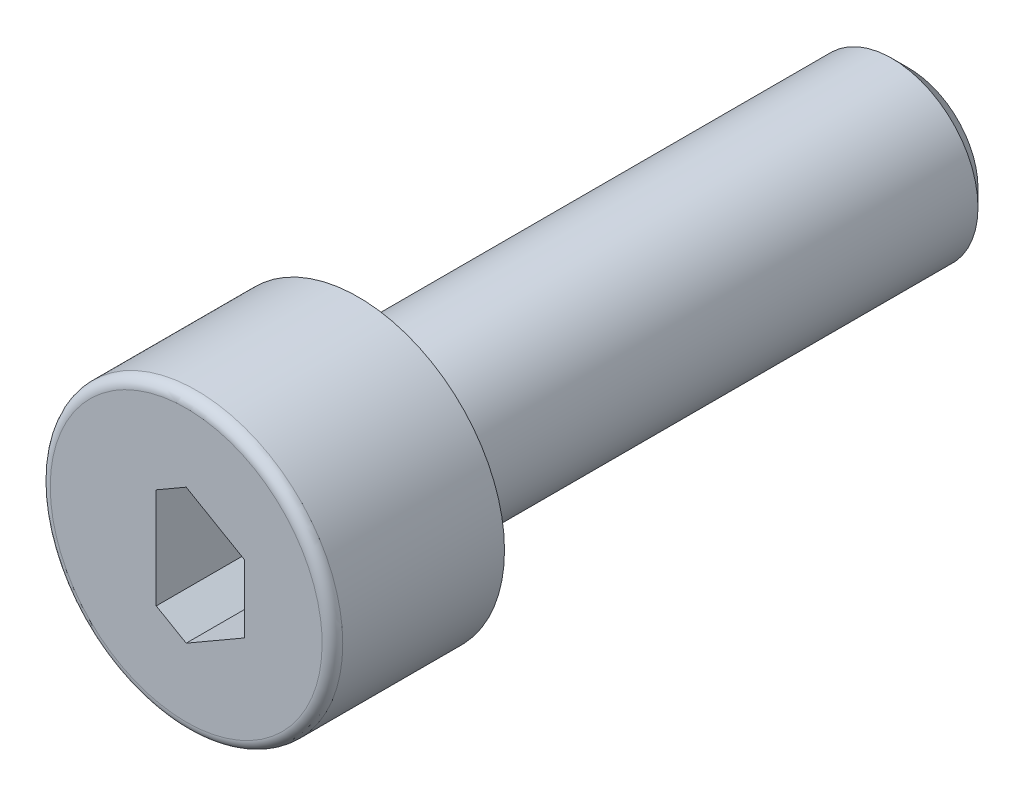
ISO-10303-21;
HEADER;
FILE_DESCRIPTION(('STEP AP214'),'2;1');
FILE_NAME('part.step','',(''),(''),'','','');
FILE_SCHEMA(('AUTOMOTIVE_DESIGN { 1 0 10303 214 1 1 1 1 }'));
ENDSEC;
DATA;
#1=APPLICATION_CONTEXT('core data for automotive mechanical design processes');
#2=APPLICATION_PROTOCOL_DEFINITION('international standard','automotive_design',2000,#1);
#3=PRODUCT_CONTEXT('',#1,'mechanical');
#4=PRODUCT('Part','Part','',(#3));
#5=PRODUCT_RELATED_PRODUCT_CATEGORY('part','',(#4));
#6=PRODUCT_DEFINITION_FORMATION('','',#4);
#7=PRODUCT_DEFINITION_CONTEXT('part definition',#1,'design');
#8=PRODUCT_DEFINITION('design','',#6,#7);
#9=PRODUCT_DEFINITION_SHAPE('','',#8);
#10=(LENGTH_UNIT() NAMED_UNIT(*) SI_UNIT(.MILLI.,.METRE.));
#11=(NAMED_UNIT(*) PLANE_ANGLE_UNIT() SI_UNIT($,.RADIAN.));
#12=(NAMED_UNIT(*) SI_UNIT($,.STERADIAN.) SOLID_ANGLE_UNIT());
#13=UNCERTAINTY_MEASURE_WITH_UNIT(LENGTH_MEASURE(1.E-05),#10,'distance_accuracy_value','');
#14=(GEOMETRIC_REPRESENTATION_CONTEXT(3) GLOBAL_UNCERTAINTY_ASSIGNED_CONTEXT((#13)) GLOBAL_UNIT_ASSIGNED_CONTEXT((#10,
#11,#12)) REPRESENTATION_CONTEXT('',''));
#15=CARTESIAN_POINT('',(0.,0.,0.));
#16=DIRECTION('',(0.,0.,1.));
#17=DIRECTION('',(1.,0.,0.));
#18=AXIS2_PLACEMENT_3D('',#15,#16,#17);
#19=CARTESIAN_POINT('',(-324.3,996.037009084755,-4.));
#20=DIRECTION('',(0.,0.,1.));
#21=DIRECTION('',(1.,0.,0.));
#22=AXIS2_PLACEMENT_3D('',#19,#20,#21);
#23=PLANE('',#22);
#24=DIRECTION('',(0.866025403784444,0.499999999999991,0.));
#25=VECTOR('',#24,1.);
#26=CARTESIAN_POINT('',(-325.999999999999,999.962990915245,-4.));
#27=LINE('',#26,#25);
#28=CARTESIAN_POINT('',(-326.869999999999,999.46069618105,-4.));
#29=VERTEX_POINT('',#28);
#30=CARTESIAN_POINT('',(-325.999999999999,999.962990915245,-4.));
#31=VERTEX_POINT('',#30);
#32=EDGE_CURVE('E71',#29,#31,#27,.T.);
#33=ORIENTED_EDGE('',*,*,#32,.F.);
#34=DIRECTION('',(0.,1.,0.));
#35=VECTOR('',#34,1.);
#36=CARTESIAN_POINT('',(-326.869999999999,997.018504542378,-4.));
#37=LINE('',#36,#35);
#38=CARTESIAN_POINT('',(-326.869999999999,996.53930381895,-4.));
#39=VERTEX_POINT('',#38);
#40=EDGE_CURVE('E73',#39,#29,#37,.T.);
#41=ORIENTED_EDGE('',*,*,#40,.F.);
#42=DIRECTION('',(-0.866025403784444,0.499999999999991,0.));
#43=VECTOR('',#42,1.);
#44=CARTESIAN_POINT('',(-327.699999999999,997.018504542378,-4.));
#45=LINE('',#44,#43);
#46=CARTESIAN_POINT('',(-325.999999999999,996.037009084755,-4.));
#47=VERTEX_POINT('',#46);
#48=EDGE_CURVE('E194',#47,#39,#45,.T.);
#49=ORIENTED_EDGE('',*,*,#48,.F.);
#50=DIRECTION('',(-0.866025403784444,-0.499999999999991,0.));
#51=VECTOR('',#50,1.);
#52=CARTESIAN_POINT('',(-325.999999999999,996.037009084755,-4.));
#53=LINE('',#52,#51);
#54=CARTESIAN_POINT('',(-324.3,997.018504542378,-4.));
#55=VERTEX_POINT('',#54);
#56=EDGE_CURVE('E199',#55,#47,#53,.T.);
#57=ORIENTED_EDGE('',*,*,#56,.F.);
#58=DIRECTION('',(0.,1.,0.));
#59=VECTOR('',#58,1.);
#60=CARTESIAN_POINT('',(-324.3,997.018504542378,-4.));
#61=LINE('',#60,#59);
#62=CARTESIAN_POINT('',(-324.3,998.981495457622,-4.));
#63=VERTEX_POINT('',#62);
#64=EDGE_CURVE('E204',#63,#55,#61,.F.);
#65=ORIENTED_EDGE('',*,*,#64,.F.);
#66=DIRECTION('',(0.866025403784444,-0.499999999999991,0.));
#67=VECTOR('',#66,1.);
#68=CARTESIAN_POINT('',(-324.3,998.981495457622,-4.));
#69=LINE('',#68,#67);
#70=EDGE_CURVE('E76',#31,#63,#69,.T.);
#71=ORIENTED_EDGE('',*,*,#70,.F.);
#72=EDGE_LOOP('',(#33,#41,#49,#57,#65,#71));
#73=FACE_BOUND('',#72,.T.);
#74=ADVANCED_FACE('F16',(#73),#23,.T.);
#75=CARTESIAN_POINT('',(-324.3,998.981495457622,-1.5));
#76=DIRECTION('',(-0.499999999999991,-0.866025403784444,0.));
#77=DIRECTION('',(0.866025403784444,-0.499999999999991,0.));
#78=AXIS2_PLACEMENT_3D('',#75,#76,#77);
#79=PLANE('',#78);
#80=DIRECTION('',(0.866025403784393,-0.500000000000079,0.));
#81=VECTOR('',#80,1.);
#82=CARTESIAN_POINT('',(-325.999999999999,999.962990915245,-1.5));
#83=LINE('',#82,#81);
#84=CARTESIAN_POINT('',(-326.,999.962990915245,-1.5));
#85=VERTEX_POINT('',#84);
#86=CARTESIAN_POINT('',(-324.3,998.981495457622,-1.5));
#87=VERTEX_POINT('',#86);
#88=EDGE_CURVE('E96',#85,#87,#83,.T.);
#89=ORIENTED_EDGE('',*,*,#88,.F.);
#90=DIRECTION('',(0.,0.,1.));
#91=VECTOR('',#90,1.);
#92=CARTESIAN_POINT('',(-325.999999999999,999.962990915245,-1.5));
#93=LINE('',#92,#91);
#94=EDGE_CURVE('E81',#31,#85,#93,.T.);
#95=ORIENTED_EDGE('',*,*,#94,.F.);
#96=ORIENTED_EDGE('',*,*,#70,.T.);
#97=DIRECTION('',(0.,0.,1.));
#98=VECTOR('',#97,1.);
#99=CARTESIAN_POINT('',(-324.3,998.981495457622,-4.));
#100=LINE('',#99,#98);
#101=EDGE_CURVE('E202',#87,#63,#100,.F.);
#102=ORIENTED_EDGE('',*,*,#101,.F.);
#103=EDGE_LOOP('',(#89,#95,#96,#102));
#104=FACE_BOUND('',#103,.T.);
#105=ADVANCED_FACE('F129',(#104),#79,.T.);
#106=CARTESIAN_POINT('',(-324.3,997.018504542378,-4.));
#107=DIRECTION('',(-1.,0.,0.));
#108=DIRECTION('',(0.,0.,1.));
#109=AXIS2_PLACEMENT_3D('',#106,#107,#108);
#110=PLANE('',#109);
#111=DIRECTION('',(0.,1.,0.));
#112=VECTOR('',#111,1.);
#113=CARTESIAN_POINT('',(-324.3,994.05,-1.5));
#114=LINE('',#113,#112);
#115=CARTESIAN_POINT('',(-324.3,997.018504542378,-1.5));
#116=VERTEX_POINT('',#115);
#117=EDGE_CURVE('E99',#87,#116,#114,.F.);
#118=ORIENTED_EDGE('',*,*,#117,.F.);
#119=ORIENTED_EDGE('',*,*,#101,.T.);
#120=ORIENTED_EDGE('',*,*,#64,.T.);
#121=DIRECTION('',(0.,0.,1.));
#122=VECTOR('',#121,1.);
#123=CARTESIAN_POINT('',(-324.3,997.018504542378,-1.5));
#124=LINE('',#123,#122);
#125=EDGE_CURVE('E196',#116,#55,#124,.F.);
#126=ORIENTED_EDGE('',*,*,#125,.F.);
#127=EDGE_LOOP('',(#118,#119,#120,#126));
#128=FACE_BOUND('',#127,.T.);
#129=ADVANCED_FACE('F132',(#128),#110,.T.);
#130=CARTESIAN_POINT('',(-325.999999999999,996.037009084755,-1.5));
#131=DIRECTION('',(-0.499999999999991,0.866025403784444,0.));
#132=DIRECTION('',(-0.866025403784444,-0.499999999999991,0.));
#133=AXIS2_PLACEMENT_3D('',#130,#131,#132);
#134=PLANE('',#133);
#135=DIRECTION('',(-0.866025403784442,-0.499999999999994,0.));
#136=VECTOR('',#135,1.);
#137=CARTESIAN_POINT('',(-324.3,997.018504542378,-1.5));
#138=LINE('',#137,#136);
#139=CARTESIAN_POINT('',(-325.999999999999,996.037009084755,-1.5));
#140=VERTEX_POINT('',#139);
#141=EDGE_CURVE('E189',#116,#140,#138,.T.);
#142=ORIENTED_EDGE('',*,*,#141,.F.);
#143=ORIENTED_EDGE('',*,*,#125,.T.);
#144=ORIENTED_EDGE('',*,*,#56,.T.);
#145=DIRECTION('',(0.,0.,1.));
#146=VECTOR('',#145,1.);
#147=CARTESIAN_POINT('',(-325.999999999999,996.037009084755,-1.5));
#148=LINE('',#147,#146);
#149=EDGE_CURVE('E90',#140,#47,#148,.F.);
#150=ORIENTED_EDGE('',*,*,#149,.F.);
#151=EDGE_LOOP('',(#142,#143,#144,#150));
#152=FACE_BOUND('',#151,.T.);
#153=ADVANCED_FACE('F136',(#152),#134,.T.);
#154=CARTESIAN_POINT('',(-327.699999999999,997.018504542378,-1.5));
#155=DIRECTION('',(0.499999999999991,0.866025403784444,0.));
#156=DIRECTION('',(-0.866025403784444,0.499999999999991,0.));
#157=AXIS2_PLACEMENT_3D('',#154,#155,#156);
#158=PLANE('',#157);
#159=DIRECTION('',(-0.866025403784432,0.500000000000012,0.));
#160=VECTOR('',#159,1.);
#161=CARTESIAN_POINT('',(-325.999999999999,996.037009084755,-1.5));
#162=LINE('',#161,#160);
#163=CARTESIAN_POINT('',(-326.869999999999,996.53930381895,-1.5));
#164=VERTEX_POINT('',#163);
#165=EDGE_CURVE('E188',#140,#164,#162,.T.);
#166=ORIENTED_EDGE('',*,*,#165,.F.);
#167=ORIENTED_EDGE('',*,*,#149,.T.);
#168=ORIENTED_EDGE('',*,*,#48,.T.);
#169=DIRECTION('',(0.,0.,-1.));
#170=VECTOR('',#169,1.);
#171=CARTESIAN_POINT('',(-326.869999999999,996.53930381895,-1.5));
#172=LINE('',#171,#170);
#173=EDGE_CURVE('E82',#164,#39,#172,.T.);
#174=ORIENTED_EDGE('',*,*,#173,.F.);
#175=EDGE_LOOP('',(#166,#167,#168,#174));
#176=FACE_BOUND('',#175,.T.);
#177=ADVANCED_FACE('F140',(#176),#158,.T.);
#178=CARTESIAN_POINT('',(-326.869999999999,997.018504542378,-1.5));
#179=DIRECTION('',(1.,0.,0.));
#180=DIRECTION('',(0.,0.,-1.));
#181=AXIS2_PLACEMENT_3D('',#178,#179,#180);
#182=PLANE('',#181);
#183=DIRECTION('',(0.,1.,0.));
#184=VECTOR('',#183,1.);
#185=CARTESIAN_POINT('',(-326.869999999999,994.05,-1.5));
#186=LINE('',#185,#184);
#187=CARTESIAN_POINT('',(-326.869999999999,999.46069618105,-1.5));
#188=VERTEX_POINT('',#187);
#189=EDGE_CURVE('E104',#164,#188,#186,.T.);
#190=ORIENTED_EDGE('',*,*,#189,.F.);
#191=ORIENTED_EDGE('',*,*,#173,.T.);
#192=ORIENTED_EDGE('',*,*,#40,.T.);
#193=DIRECTION('',(0.,0.,-1.));
#194=VECTOR('',#193,1.);
#195=CARTESIAN_POINT('',(-326.869999999999,999.46069618105,-1.5));
#196=LINE('',#195,#194);
#197=EDGE_CURVE('E88',#188,#29,#196,.T.);
#198=ORIENTED_EDGE('',*,*,#197,.F.);
#199=EDGE_LOOP('',(#190,#191,#192,#198));
#200=FACE_BOUND('',#199,.T.);
#201=ADVANCED_FACE('F87',(#200),#182,.T.);
#202=CARTESIAN_POINT('',(-325.999999999999,999.962990915245,-1.5));
#203=DIRECTION('',(0.499999999999991,-0.866025403784444,0.));
#204=DIRECTION('',(0.866025403784444,0.499999999999991,0.));
#205=AXIS2_PLACEMENT_3D('',#202,#203,#204);
#206=PLANE('',#205);
#207=DIRECTION('',(0.866025403784439,0.5,0.));
#208=VECTOR('',#207,1.);
#209=CARTESIAN_POINT('',(-327.7,998.981495457622,-1.5));
#210=LINE('',#209,#208);
#211=EDGE_CURVE('E94',#188,#85,#210,.T.);
#212=ORIENTED_EDGE('',*,*,#211,.F.);
#213=ORIENTED_EDGE('',*,*,#197,.T.);
#214=ORIENTED_EDGE('',*,*,#32,.T.);
#215=ORIENTED_EDGE('',*,*,#94,.T.);
#216=EDGE_LOOP('',(#212,#213,#214,#215));
#217=FACE_BOUND('',#216,.T.);
#218=ADVANCED_FACE('F92',(#217),#206,.T.);
#219=CARTESIAN_POINT('',(-322.049999999999,994.05,-1.5));
#220=DIRECTION('',(0.,0.,1.));
#221=DIRECTION('',(1.,0.,0.));
#222=AXIS2_PLACEMENT_3D('',#219,#220,#221);
#223=PLANE('',#222);
#224=CARTESIAN_POINT('',(-325.999999999999,998.,-1.50000000000003));
#225=DIRECTION('',(0.,0.,1.));
#226=DIRECTION('',(0.,-1.,0.));
#227=AXIS2_PLACEMENT_3D('',#224,#225,#226);
#228=CIRCLE('',#227,3.94999999999958);
#229=CARTESIAN_POINT('',(-322.05,997.99999970947,-1.50000000000003));
#230=VERTEX_POINT('',#229);
#231=CARTESIAN_POINT('',(-329.949999999999,998.000000559802,-1.50000000000003));
#232=VERTEX_POINT('',#231);
#233=EDGE_CURVE('E20',#230,#232,#228,.F.);
#234=ORIENTED_EDGE('',*,*,#233,.F.);
#235=CARTESIAN_POINT('',(-329.949999999999,998.000000559802,-1.50000000000003));
#236=CARTESIAN_POINT('',(-329.950000201211,998.041520300938,-1.50000000000003));
#237=CARTESIAN_POINT('',(-329.949345348693,998.083039822195,-1.50000000000003));
#238=CARTESIAN_POINT('',(-329.946746883813,998.165411616338,-1.50000000000003));
#239=CARTESIAN_POINT('',(-329.944822858638,998.206264507837,-1.50000000000004));
#240=CARTESIAN_POINT('',(-329.939746180695,998.287266126637,-1.50000000000004));
#241=CARTESIAN_POINT('',(-329.936612794236,998.327416056794,-1.50000000000004));
#242=CARTESIAN_POINT('',(-329.92917835615,998.406976402403,-1.50000000000005));
#243=CARTESIAN_POINT('',(-329.92489622207,998.446388607871,-1.50000000000005));
#244=CARTESIAN_POINT('',(-329.910503710292,998.562539695931,-1.50000000000008));
#245=CARTESIAN_POINT('',(-329.898726680059,998.639079214281,-1.50000000000011));
#246=CARTESIAN_POINT('',(-329.871150474946,998.7888649247,-1.50000000000024));
#247=CARTESIAN_POINT('',(-329.855493770986,998.862137545276,-1.50000000000034));
#248=CARTESIAN_POINT('',(-329.820632729762,999.00524156466,-1.50000000000064));
#249=CARTESIAN_POINT('',(-329.80156452867,999.075106103458,-1.50000000000085));
#250=CARTESIAN_POINT('',(-329.760343546415,999.21128369495,-1.50000000000144));
#251=CARTESIAN_POINT('',(-329.73832030513,999.277635994192,-1.50000000000182));
#252=CARTESIAN_POINT('',(-329.691636635685,999.406723012603,-1.50000000000285));
#253=CARTESIAN_POINT('',(-329.667099002665,999.469502158809,-1.50000000000349));
#254=CARTESIAN_POINT('',(-329.615815913377,999.591413907714,-1.50000000000512));
#255=CARTESIAN_POINT('',(-329.589186425091,999.650595315758,-1.5000000000061));
#256=CARTESIAN_POINT('',(-329.534128862298,999.765316224483,-1.50000000000854));
#257=CARTESIAN_POINT('',(-329.505809914452,999.820908118998,-1.50000000000997));
#258=CARTESIAN_POINT('',(-329.447761051236,999.92848392741,-1.50000000001344));
#259=CARTESIAN_POINT('',(-329.418133464703,999.980523079904,-1.50000000001545));
#260=CARTESIAN_POINT('',(-329.357832286438,1000.08105268043,-1.5000000000202));
#261=CARTESIAN_POINT('',(-329.327254319956,1000.12960050847,-1.50000000002292));
#262=CARTESIAN_POINT('',(-329.265394077482,1000.22322826329,-1.50000000002925));
#263=CARTESIAN_POINT('',(-329.234200860539,1000.26836705211,-1.50000000003283));
#264=CARTESIAN_POINT('',(-329.171428297444,1000.35527545742,-1.50000000004105));
#265=CARTESIAN_POINT('',(-329.139931618013,1000.3971048026,-1.50000000004564));
#266=CARTESIAN_POINT('',(-329.076846886734,1000.47750757276,-1.50000000005609));
#267=CARTESIAN_POINT('',(-329.045335312077,1000.51614102265,-1.50000000006188));
#268=CARTESIAN_POINT('',(-328.982492410992,1000.59027666666,-1.50000000007494));
#269=CARTESIAN_POINT('',(-328.951231601381,1000.62583865309,-1.50000000008212));
#270=CARTESIAN_POINT('',(-328.889139488024,1000.69396436586,-1.50000000009817));
#271=CARTESIAN_POINT('',(-328.858372977514,1000.72658717422,-1.50000000010694));
#272=CARTESIAN_POINT('',(-328.797496415016,1000.7889737285,-1.50000000012643));
#273=CARTESIAN_POINT('',(-328.767445719189,1000.81879538064,-1.50000000013702));
#274=CARTESIAN_POINT('',(-328.708208722116,1000.87572067657,-1.50000000016039));
#275=CARTESIAN_POINT('',(-328.679076499729,1000.90288073217,-1.50000000017301));
#276=CARTESIAN_POINT('',(-328.596040958612,1000.97797961694,-1.50000000021329));
#277=CARTESIAN_POINT('',(-328.541212169472,1001.0249031719,-1.50000000024485));
#278=CARTESIAN_POINT('',(-328.436860662363,1001.10936960294,-1.50000000032054));
#279=CARTESIAN_POINT('',(-328.387658604604,1001.14731020448,-1.50000000036231));
#280=CARTESIAN_POINT('',(-328.295597052191,1001.2148996821,-1.50000000046472));
#281=CARTESIAN_POINT('',(-328.252994622025,1001.24489888833,-1.50000000052122));
#282=CARTESIAN_POINT('',(-328.174942663191,1001.29758258538,-1.50000000064918));
#283=CARTESIAN_POINT('',(-328.139693367367,1001.32056419649,-1.50000000071567));
#284=CARTESIAN_POINT('',(-328.0769595213,1001.36005199479,-1.50000000089137));
#285=CARTESIAN_POINT('',(-328.0496250007,1001.37679687997,-1.50000000098664));
#286=CARTESIAN_POINT('',(-328.003164365647,1001.40448640261,-1.50000000117243));
#287=CARTESIAN_POINT('',(-327.984143524184,1001.41560784222,-1.50000000125512));
#288=CARTESIAN_POINT('',(-327.954612086012,1001.43254672642,-1.50000000154896));
#289=CARTESIAN_POINT('',(-327.944165377987,1001.43847602498,-1.50000000168458));
#290=CARTESIAN_POINT('',(-327.879288447023,1001.4749098052,-1.50000000283912));
#291=CARTESIAN_POINT('',(-327.824156993508,1001.50418157614,-1.50000000517701));
#292=CARTESIAN_POINT('',(-327.709970304559,1001.56137585183,-1.50000001023269));
#293=CARTESIAN_POINT('',(-327.650851932599,1001.58917194741,-1.5000000129631));
#294=CARTESIAN_POINT('',(-327.528647243855,1001.64297029384,-1.50000001887059));
#295=CARTESIAN_POINT('',(-327.465501443755,1001.6688376059,-1.50000002206214));
#296=CARTESIAN_POINT('',(-327.335235820325,1001.71829764506,-1.50000002839604));
#297=CARTESIAN_POINT('',(-327.268061322337,1001.74174645467,-1.50000003153048));
#298=CARTESIAN_POINT('',(-327.129774837884,1001.78586522178,-1.50000003749404));
#299=CARTESIAN_POINT('',(-327.058614136891,1001.80638242388,-1.50000004030544));
#300=CARTESIAN_POINT('',(-326.912431425595,1001.84411129798,-1.5000000453769));
#301=CARTESIAN_POINT('',(-326.837367514539,1001.86116153976,-1.50000004761098));
#302=CARTESIAN_POINT('',(-326.723060882825,1001.88363523797,-1.50000005039729));
#303=CARTESIAN_POINT('',(-326.684130472807,1001.89068322963,-1.50000005123933));
#304=CARTESIAN_POINT('',(-326.605357000374,1001.90372524151,-1.50000005272512));
#305=CARTESIAN_POINT('',(-326.565510311683,1001.9096975173,-1.50000005336495));
#306=CARTESIAN_POINT('',(-326.484932763569,1001.92051657385,-1.50000005443419));
#307=CARTESIAN_POINT('',(-326.444198922404,1001.9253411048,-1.5000000548596));
#308=CARTESIAN_POINT('',(-326.361877530669,1001.93379313558,-1.50000005549227));
#309=CARTESIAN_POINT('',(-326.320287643676,1001.93739790692,-1.50000005569554));
#310=CARTESIAN_POINT('',(-326.236289454195,1001.94333835224,-1.50000005588011));
#311=CARTESIAN_POINT('',(-326.193879511006,1001.94565083486,-1.50000005585749));
#312=CARTESIAN_POINT('',(-326.108280765557,1001.94893451922,-1.50000005559058));
#313=CARTESIAN_POINT('',(-326.065091055509,1001.94988208854,-1.5000000553425));
#314=CARTESIAN_POINT('',(-325.977976959328,1001.95036382441,-1.50000005462898));
#315=CARTESIAN_POINT('',(-325.934052439131,1001.94987394084,-1.50000005415996));
#316=CARTESIAN_POINT('',(-325.845517629247,1001.94740897653,-1.50000005301292));
#317=CARTESIAN_POINT('',(-325.800908018927,1001.94540945416,-1.50000005233157));
#318=CARTESIAN_POINT('',(-325.711056817735,1001.93985401025,-1.50000005077233));
#319=CARTESIAN_POINT('',(-325.665816759362,1001.93627328434,-1.50000004989141));
#320=CARTESIAN_POINT('',(-325.57476346148,1001.92748511188,-1.5000000479495));
#321=CARTESIAN_POINT('',(-325.528952646807,1001.92225252981,-1.50000004688586));
#322=CARTESIAN_POINT('',(-325.436821767173,1001.91009150904,-1.50000004459907));
#323=CARTESIAN_POINT('',(-325.390505058017,1001.90313763804,-1.50000004337366));
#324=CARTESIAN_POINT('',(-325.297431556873,1001.88746641227,-1.50000004078797));
#325=CARTESIAN_POINT('',(-325.25067908952,1001.8787233657,-1.50000003942589));
#326=CARTESIAN_POINT('',(-325.156808563041,1001.8594080113,-1.50000003659553));
#327=CARTESIAN_POINT('',(-325.109695834317,1001.84880979228,-1.50000003512595));
#328=CARTESIAN_POINT('',(-325.015184679606,1001.82572052467,-1.50000003211335));
#329=CARTESIAN_POINT('',(-324.9677926255,1001.81320338887,-1.50000003056954));
#330=CARTESIAN_POINT('',(-324.872808165162,1001.78621530705,-1.50000002744547));
#331=CARTESIAN_POINT('',(-324.825223206767,1001.77171814393,-1.50000002586501));
#332=CARTESIAN_POINT('',(-324.729943754066,1001.74071199279,-1.50000002270796));
#333=CARTESIAN_POINT('',(-324.682257816248,1001.72417670682,-1.50000002113178));
#334=CARTESIAN_POINT('',(-324.586872751343,1001.68903972606,-1.50000001803046));
#335=CARTESIAN_POINT('',(-324.539183321054,1001.67041170541,-1.50000001650637));
#336=CARTESIAN_POINT('',(-324.443892934178,1001.63103831076,-1.50000001355015));
#337=CARTESIAN_POINT('',(-324.396302841513,1001.61026663586,-1.50000001211963));
#338=CARTESIAN_POINT('',(-324.30131881429,1001.56655988412,-1.50000000943484));
#339=CARTESIAN_POINT('',(-324.253936945951,1001.54359859883,-1.50000000818331));
#340=CARTESIAN_POINT('',(-324.159480142113,1001.49546880184,-1.50000000579509));
#341=CARTESIAN_POINT('',(-324.112418467903,1001.470274201,-1.50000000466022));
#342=CARTESIAN_POINT('',(-324.045949186027,1001.43293911058,-1.50000000349569));
#343=CARTESIAN_POINT('',(-324.026106882145,1001.42156626872,-1.50000000320506));
#344=CARTESIAN_POINT('',(-323.979222811755,1001.39415138772,-1.50000000265165));
#345=CARTESIAN_POINT('',(-323.952269908476,1001.37795687025,-1.50000000244014));
#346=CARTESIAN_POINT('',(-323.891464400805,1001.34042726082,-1.5000000020236));
#347=CARTESIAN_POINT('',(-323.857733840257,1001.31889428065,-1.50000000183605));
#348=CARTESIAN_POINT('',(-323.783788472817,1001.27009226777,-1.50000000148887));
#349=CARTESIAN_POINT('',(-323.743732329964,1001.24258253063,-1.5000000013438));
#350=CARTESIAN_POINT('',(-323.657687080641,1001.18112210198,-1.50000000107508));
#351=CARTESIAN_POINT('',(-323.611897821366,1001.14689124416,-1.5000000009597));
#352=CARTESIAN_POINT('',(-323.515096406656,1001.07119560857,-1.50000000075094));
#353=CARTESIAN_POINT('',(-323.464330545912,1001.0294157485,-1.50000000066344));
#354=CARTESIAN_POINT('',(-323.358463573771,1000.93776151918,-1.5000000005069));
#355=CARTESIAN_POINT('',(-323.303660171754,1000.88754199295,-1.50000000044176));
#356=CARTESIAN_POINT('',(-323.221343189538,1000.80772370337,-1.50000000035835));
#357=CARTESIAN_POINT('',(-323.19279667412,1000.77918165132,-1.50000000033227));
#358=CARTESIAN_POINT('',(-323.135098922394,1000.71969694802,-1.50000000028404));
#359=CARTESIAN_POINT('',(-323.105996027689,1000.68870729259,-1.50000000026217));
#360=CARTESIAN_POINT('',(-323.047364406161,1000.62421950742,-1.50000000022194));
#361=CARTESIAN_POINT('',(-323.017888163101,1000.5906736741,-1.5000000002038));
#362=CARTESIAN_POINT('',(-322.958702918614,1000.52096837822,-1.50000000017062));
#363=CARTESIAN_POINT('',(-322.929050627316,1000.48476074389,-1.50000000015576));
#364=CARTESIAN_POINT('',(-322.869723226535,1000.40963306847,-1.50000000012876));
#365=CARTESIAN_POINT('',(-322.840109245098,1000.37066474374,-1.50000000011676));
#366=CARTESIAN_POINT('',(-322.781085038777,1000.2899247169,-1.50000000009511));
#367=CARTESIAN_POINT('',(-322.751740507681,1000.24810497578,-1.50000000008558));
#368=CARTESIAN_POINT('',(-322.693498849237,1000.16158121777,-1.50000000006853));
#369=CARTESIAN_POINT('',(-322.664672122793,1000.1168297982,-1.50000000006111));
#370=CARTESIAN_POINT('',(-322.607726832721,1000.02437406982,-1.50000000004795));
#371=CARTESIAN_POINT('',(-322.579683497288,999.976623412352,-1.5000000000423));
#372=CARTESIAN_POINT('',(-322.524582773501,999.878115288461,-1.5000000000324));
#373=CARTESIAN_POINT('',(-322.497605538829,999.82731297362,-1.50000000002821));
#374=CARTESIAN_POINT('',(-322.44493149817,999.722664831366,-1.50000000002097));
#375=CARTESIAN_POINT('',(-322.41931984268,999.668776129439,-1.50000000001797));
#376=CARTESIAN_POINT('',(-322.369687565555,999.557938369076,-1.50000000001287));
#377=CARTESIAN_POINT('',(-322.345757131688,999.500948910561,-1.50000000001081));
#378=CARTESIAN_POINT('',(-322.299813167207,999.383915394347,-1.50000000000738));
#379=CARTESIAN_POINT('',(-322.277894866661,999.323833937146,-1.50000000000604));
#380=CARTESIAN_POINT('',(-322.236315136858,999.200647601006,-1.50000000000387));
#381=CARTESIAN_POINT('',(-322.216753945253,999.137508873179,-1.50000000000306));
#382=CARTESIAN_POINT('',(-322.180240965147,999.008267463941,-1.5000000000018));
#383=CARTESIAN_POINT('',(-322.163394341891,998.942135055991,-1.50000000000136));
#384=CARTESIAN_POINT('',(-322.132673785488,998.806996928091,-1.5000000000007));
#385=CARTESIAN_POINT('',(-322.118909818432,998.73796619435,-1.5000000000005));
#386=CARTESIAN_POINT('',(-322.094726016496,998.597156115717,-1.50000000000021));
#387=CARTESIAN_POINT('',(-322.084420758069,998.525357076088,-1.50000000000014));
#388=CARTESIAN_POINT('',(-322.067532466823,998.379171877386,-1.50000000000006));
#389=CARTESIAN_POINT('',(-322.061068408416,998.304771957941,-1.50000000000004));
#390=CARTESIAN_POINT('',(-322.052239361909,998.153586251964,-1.50000000000003));
#391=CARTESIAN_POINT('',(-322.049997331444,998.076793269274,-1.50000000000004));
#392=CARTESIAN_POINT('',(-322.05,997.99999970947,-1.50000000000003));
#393=B_SPLINE_CURVE_WITH_KNOTS('',3,(#235,#236,#237,#238,#239,#240,#241,#242,#243,#244,#245,
#246,#247,#248,#249,#250,#251,#252,#253,#254,#255,#256,#257,#258,#259,#260,#261,#262,#263,#264,
#265,#266,#267,#268,#269,#270,#271,#272,#273,#274,#275,#276,#277,#278,#279,#280,#281,#282,#283,
#284,#285,#286,#287,#288,#289,#290,#291,#292,#293,#294,#295,#296,#297,#298,#299,#300,#301,#302,
#303,#304,#305,#306,#307,#308,#309,#310,#311,#312,#313,#314,#315,#316,#317,#318,#319,#320,#321,
#322,#323,#324,#325,#326,#327,#328,#329,#330,#331,#332,#333,#334,#335,#336,#337,#338,#339,#340,
#341,#342,#343,#344,#345,#346,#347,#348,#349,#350,#351,#352,#353,#354,#355,#356,#357,#358,#359,
#360,#361,#362,#363,#364,#365,#366,#367,#368,#369,#370,#371,#372,#373,#374,#375,#376,#377,#378,
#379,#380,#381,#382,#383,#384,#385,#386,#387,#388,#389,#390,#391,#392),.UNSPECIFIED.,.F.,.F.,(4,
2,2,2,2,2,2,2,2,2,2,2,2,2,2,2,2,2,2,2,2,2,2,2,2,2,2,2,2,2,2,2,2,2,2,2,2,2,2,2,2,2,2,2,2,2,2,2,2,
2,2,2,2,2,2,2,2,2,2,2,2,2,2,2,2,2,2,2,2,2,2,2,2,2,2,2,2,2,4),(0.,0.124553602267692,
0.247228577186569,0.368024918302497,0.486942619244315,0.719117001172008,0.943779104725157,
1.16092872943295,1.37056568125002,1.57268977255654,1.76730082215872,1.95439865528862,
2.13398310360433,2.30605400519017,2.47061120455672,2.62765455264151,2.77718390680829,
2.91919913084737,3.05370009497665,3.18068667584009,3.30015875650944,3.51653871054522,
3.70286675600257,3.85914016535095,3.9853566437355,4.08151431677314,4.14761174469716,
4.18364791709308,4.3708295716187,4.56673241918978,4.77135613233414,4.98470034350057,
5.20676465210211,5.43754860394722,5.55622368965017,5.67707925175056,5.80011525063355,
5.92533164467811,6.05272839025713,6.18230544173751,6.31406275148017,6.4480002698401,
6.58411794516648,6.72241572380255,6.86289355008579,7.00555136634807,7.15038912198924,
7.29740674652705,7.44660417627612,7.59798134554564,7.75153818663946,7.90727462985558,
8.06519060348669,8.22528603381995,8.29389499013039,8.38821745131919,8.50825235628736,
8.65399837878377,8.82545393889215,9.02261717186804,9.24548595614751,9.36657337753104,
9.49408865671137,9.62803170722532,9.7684024388094,9.91520075739962,10.0684265651313,
10.22807976034,10.3941602375601,10.5666678875264,10.7456025971732,10.9309642496345,
11.1227527242446,11.3209678965377,11.525609638248,11.7366778173096,11.9541722978572,
12.1780929402257,12.4084396009502),.UNSPECIFIED.);
#394=EDGE_CURVE('E107',#232,#230,#393,.T.);
#395=ORIENTED_EDGE('',*,*,#394,.F.);
#396=EDGE_LOOP('',(#234,#395));
#397=FACE_BOUND('',#396,.T.);
#398=ORIENTED_EDGE('',*,*,#189,.T.);
#399=ORIENTED_EDGE('',*,*,#211,.T.);
#400=ORIENTED_EDGE('',*,*,#88,.T.);
#401=ORIENTED_EDGE('',*,*,#117,.T.);
#402=ORIENTED_EDGE('',*,*,#141,.T.);
#403=ORIENTED_EDGE('',*,*,#165,.T.);
#404=EDGE_LOOP('',(#398,#399,#400,#401,#402,#403));
#405=FACE_BOUND('',#404,.T.);
#406=ADVANCED_FACE('F123',(#397,#405),#223,.T.);
#407=CARTESIAN_POINT('',(-325.999999999999,998.,-1.80000000000001));
#408=DIRECTION('',(0.,0.,1.));
#409=DIRECTION('',(0.,-1.,0.));
#410=AXIS2_PLACEMENT_3D('',#407,#408,#409);
#411=TOROIDAL_SURFACE('',#410,3.94999999999961,0.299999999999974);
#412=CARTESIAN_POINT('',(-325.999999999999,998.,-1.79999999999997));
#413=DIRECTION('',(0.,0.,1.));
#414=DIRECTION('',(1.,0.,0.));
#415=AXIS2_PLACEMENT_3D('',#412,#413,#414);
#416=CIRCLE('',#415,4.24999999999998);
#417=CARTESIAN_POINT('',(-321.75,998.,-1.79999999999997));
#418=VERTEX_POINT('',#417);
#419=EDGE_CURVE('E111',#418,#418,#416,.F.);
#420=ORIENTED_EDGE('',*,*,#419,.F.);
#421=EDGE_LOOP('',(#420));
#422=FACE_BOUND('',#421,.T.);
#423=ORIENTED_EDGE('',*,*,#394,.T.);
#424=ORIENTED_EDGE('',*,*,#233,.T.);
#425=EDGE_LOOP('',(#423,#424));
#426=FACE_BOUND('',#425,.T.);
#427=ADVANCED_FACE('F113',(#422,#426),#411,.T.);
#428=CARTESIAN_POINT('',(-328.009499999999,995.9905,-22.5));
#429=DIRECTION('',(0.,0.,-1.));
#430=DIRECTION('',(-1.,0.,0.));
#431=AXIS2_PLACEMENT_3D('',#428,#429,#430);
#432=PLANE('',#431);
#433=CARTESIAN_POINT('',(-325.999999999999,998.,-22.5000000000364));
#434=DIRECTION('',(0.,0.,1.));
#435=DIRECTION('',(1.,0.,0.));
#436=AXIS2_PLACEMENT_3D('',#433,#434,#435);
#437=CIRCLE('',#436,2.00950000004374);
#438=CARTESIAN_POINT('',(-323.990499999956,998.,-22.5000000000364));
#439=VERTEX_POINT('',#438);
#440=EDGE_CURVE('E176',#439,#439,#437,.T.);
#441=ORIENTED_EDGE('',*,*,#440,.F.);
#442=EDGE_LOOP('',(#441));
#443=FACE_BOUND('',#442,.T.);
#444=ADVANCED_FACE('F122',(#443),#432,.T.);
#445=CARTESIAN_POINT('',(-325.999999999999,998.,-1.5));
#446=DIRECTION('',(0.,0.,1.));
#447=DIRECTION('',(1.,0.,0.));
#448=AXIS2_PLACEMENT_3D('',#445,#446,#447);
#449=CYLINDRICAL_SURFACE('',#448,4.24999999999998);
#450=ORIENTED_EDGE('',*,*,#419,.T.);
#451=EDGE_LOOP('',(#450));
#452=FACE_BOUND('',#451,.T.);
#453=CARTESIAN_POINT('',(-325.999999999999,998.,-6.50000000000001));
#454=DIRECTION('',(0.,0.,1.));
#455=DIRECTION('',(1.,0.,0.));
#456=AXIS2_PLACEMENT_3D('',#453,#454,#455);
#457=CIRCLE('',#456,4.24999999999998);
#458=CARTESIAN_POINT('',(-321.75,998.,-6.50000000000001));
#459=VERTEX_POINT('',#458);
#460=EDGE_CURVE('E170',#459,#459,#457,.F.);
#461=ORIENTED_EDGE('',*,*,#460,.F.);
#462=EDGE_LOOP('',(#461));
#463=FACE_BOUND('',#462,.T.);
#464=ADVANCED_FACE('F151',(#452,#463),#449,.T.);
#465=CARTESIAN_POINT('',(-325.999999999999,998.,-22.0095000000811));
#466=DIRECTION('',(0.,0.,1.));
#467=DIRECTION('',(1.,0.,0.));
#468=AXIS2_PLACEMENT_3D('',#465,#466,#467);
#469=CONICAL_SURFACE('',#468,2.49999999999906,0.785398163397448);
#470=CARTESIAN_POINT('',(-325.999999999999,998.,-22.0095));
#471=DIRECTION('',(0.,0.,1.));
#472=DIRECTION('',(1.,0.,0.));
#473=AXIS2_PLACEMENT_3D('',#470,#471,#472);
#474=CIRCLE('',#473,2.5);
#475=CARTESIAN_POINT('',(-323.499999999999,998.,-22.0095));
#476=VERTEX_POINT('',#475);
#477=EDGE_CURVE('E26',#476,#476,#474,.T.);
#478=ORIENTED_EDGE('',*,*,#477,.F.);
#479=EDGE_LOOP('',(#478));
#480=FACE_BOUND('',#479,.T.);
#481=ORIENTED_EDGE('',*,*,#440,.T.);
#482=EDGE_LOOP('',(#481));
#483=FACE_BOUND('',#482,.T.);
#484=ADVANCED_FACE('F155',(#480,#483),#469,.T.);
#485=CARTESIAN_POINT('',(-330.249999999999,993.75,-6.50000000000001));
#486=DIRECTION('',(0.,0.,-1.));
#487=DIRECTION('',(-1.,0.,0.));
#488=AXIS2_PLACEMENT_3D('',#485,#486,#487);
#489=PLANE('',#488);
#490=ORIENTED_EDGE('',*,*,#460,.T.);
#491=EDGE_LOOP('',(#490));
#492=FACE_BOUND('',#491,.T.);
#493=CARTESIAN_POINT('',(-325.999999999999,998.,-6.50000000000001));
#494=DIRECTION('',(0.,0.,1.));
#495=DIRECTION('',(1.,0.,0.));
#496=AXIS2_PLACEMENT_3D('',#493,#494,#495);
#497=CIRCLE('',#496,2.5);
#498=CARTESIAN_POINT('',(-323.499999999999,998.,-6.50000000000001));
#499=VERTEX_POINT('',#498);
#500=EDGE_CURVE('E11',#499,#499,#497,.F.);
#501=ORIENTED_EDGE('',*,*,#500,.F.);
#502=EDGE_LOOP('',(#501));
#503=FACE_BOUND('',#502,.T.);
#504=ADVANCED_FACE('F158',(#492,#503),#489,.T.);
#505=CARTESIAN_POINT('',(-325.999999999999,998.,-1.5));
#506=DIRECTION('',(0.,0.,1.));
#507=DIRECTION('',(1.,0.,0.));
#508=AXIS2_PLACEMENT_3D('',#505,#506,#507);
#509=CYLINDRICAL_SURFACE('',#508,2.5);
#510=ORIENTED_EDGE('',*,*,#500,.T.);
#511=EDGE_LOOP('',(#510));
#512=FACE_BOUND('',#511,.T.);
#513=ORIENTED_EDGE('',*,*,#477,.T.);
#514=EDGE_LOOP('',(#513));
#515=FACE_BOUND('',#514,.T.);
#516=ADVANCED_FACE('F18',(#512,#515),#509,.T.);
#517=CLOSED_SHELL('',(#74,#105,#129,#153,#177,#201,#218,#406,#427,#444,#464,#484,#504,#516));
#518=MANIFOLD_SOLID_BREP('B1',#517);
#519=ADVANCED_BREP_SHAPE_REPRESENTATION('',(#18,#518),#14);
#520=SHAPE_DEFINITION_REPRESENTATION(#9,#519);
ENDSEC;
END-ISO-10303-21;
